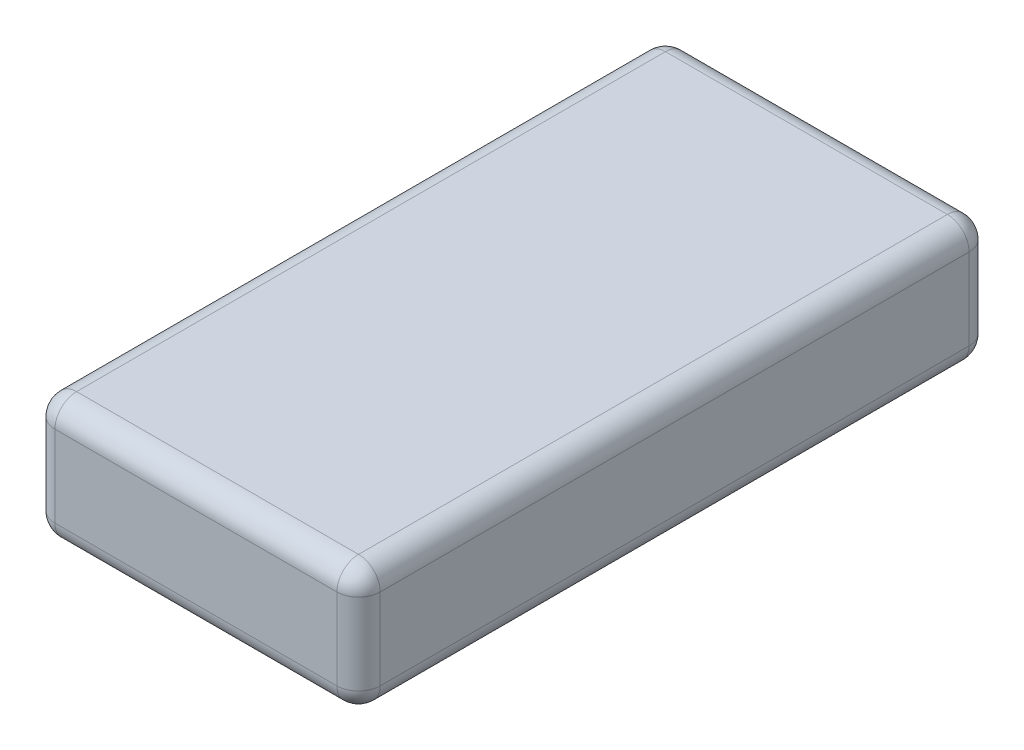
ISO-10303-21;
HEADER;
FILE_DESCRIPTION(('STEP AP214'),'2;1');
FILE_NAME('part.step','',(''),(''),'','','');
FILE_SCHEMA(('AUTOMOTIVE_DESIGN { 1 0 10303 214 1 1 1 1 }'));
ENDSEC;
DATA;
#1=APPLICATION_CONTEXT('core data for automotive mechanical design processes');
#2=APPLICATION_PROTOCOL_DEFINITION('international standard','automotive_design',2000,#1);
#3=PRODUCT_CONTEXT('',#1,'mechanical');
#4=PRODUCT('Part','Part','',(#3));
#5=PRODUCT_RELATED_PRODUCT_CATEGORY('part','',(#4));
#6=PRODUCT_DEFINITION_FORMATION('','',#4);
#7=PRODUCT_DEFINITION_CONTEXT('part definition',#1,'design');
#8=PRODUCT_DEFINITION('design','',#6,#7);
#9=PRODUCT_DEFINITION_SHAPE('','',#8);
#10=(LENGTH_UNIT() NAMED_UNIT(*) SI_UNIT(.MILLI.,.METRE.));
#11=(NAMED_UNIT(*) PLANE_ANGLE_UNIT() SI_UNIT($,.RADIAN.));
#12=(NAMED_UNIT(*) SI_UNIT($,.STERADIAN.) SOLID_ANGLE_UNIT());
#13=UNCERTAINTY_MEASURE_WITH_UNIT(LENGTH_MEASURE(1.E-05),#10,'distance_accuracy_value','');
#14=(GEOMETRIC_REPRESENTATION_CONTEXT(3) GLOBAL_UNCERTAINTY_ASSIGNED_CONTEXT((#13)) GLOBAL_UNIT_ASSIGNED_CONTEXT((#10,
#11,#12)) REPRESENTATION_CONTEXT('',''));
#15=CARTESIAN_POINT('',(0.,0.,0.));
#16=DIRECTION('',(0.,0.,1.));
#17=DIRECTION('',(1.,0.,0.));
#18=AXIS2_PLACEMENT_3D('',#15,#16,#17);
#19=CARTESIAN_POINT('',(15.,11.5,-29.15));
#20=DIRECTION('',(-1.,0.,0.));
#21=DIRECTION('',(0.,0.,1.));
#22=AXIS2_PLACEMENT_3D('',#19,#20,#21);
#23=PLANE('',#22);
#24=DIRECTION('',(0.,-1.,0.));
#25=VECTOR('',#24,1.);
#26=CARTESIAN_POINT('',(15.,11.5,27.15));
#27=LINE('',#26,#25);
#28=CARTESIAN_POINT('',(15.,9.5,27.15));
#29=VERTEX_POINT('',#28);
#30=CARTESIAN_POINT('',(15.,2.,27.15));
#31=VERTEX_POINT('',#30);
#32=EDGE_CURVE('E131',#29,#31,#27,.T.);
#33=ORIENTED_EDGE('',*,*,#32,.T.);
#34=DIRECTION('',(0.,0.,-1.));
#35=VECTOR('',#34,1.);
#36=CARTESIAN_POINT('',(15.,2.,-29.15));
#37=LINE('',#36,#35);
#38=CARTESIAN_POINT('',(15.,2.,-27.15));
#39=VERTEX_POINT('',#38);
#40=EDGE_CURVE('E127',#31,#39,#37,.T.);
#41=ORIENTED_EDGE('',*,*,#40,.T.);
#42=DIRECTION('',(0.,-1.,0.));
#43=VECTOR('',#42,1.);
#44=CARTESIAN_POINT('',(15.,11.5,-27.15));
#45=LINE('',#44,#43);
#46=CARTESIAN_POINT('',(15.,9.5,-27.15));
#47=VERTEX_POINT('',#46);
#48=EDGE_CURVE('E120',#39,#47,#45,.F.);
#49=ORIENTED_EDGE('',*,*,#48,.T.);
#50=DIRECTION('',(0.,0.,-1.));
#51=VECTOR('',#50,1.);
#52=CARTESIAN_POINT('',(15.,9.5,29.15));
#53=LINE('',#52,#51);
#54=EDGE_CURVE('E124',#47,#29,#53,.F.);
#55=ORIENTED_EDGE('',*,*,#54,.T.);
#56=EDGE_LOOP('',(#33,#41,#49,#55));
#57=FACE_BOUND('',#56,.T.);
#58=ADVANCED_FACE('F33',(#57),#23,.F.);
#59=CARTESIAN_POINT('',(-15.,11.5,-29.15));
#60=DIRECTION('',(0.,0.,1.));
#61=DIRECTION('',(1.,0.,0.));
#62=AXIS2_PLACEMENT_3D('',#59,#60,#61);
#63=PLANE('',#62);
#64=DIRECTION('',(-1.,0.,0.));
#65=VECTOR('',#64,1.);
#66=CARTESIAN_POINT('',(15.,9.5,-29.15));
#67=LINE('',#66,#65);
#68=CARTESIAN_POINT('',(-13.,9.5,-29.15));
#69=VERTEX_POINT('',#68);
#70=CARTESIAN_POINT('',(13.,9.5,-29.15));
#71=VERTEX_POINT('',#70);
#72=EDGE_CURVE('E186',#69,#71,#67,.F.);
#73=ORIENTED_EDGE('',*,*,#72,.T.);
#74=DIRECTION('',(0.,-1.,0.));
#75=VECTOR('',#74,1.);
#76=CARTESIAN_POINT('',(13.,11.5,-29.15));
#77=LINE('',#76,#75);
#78=CARTESIAN_POINT('',(13.,2.,-29.15));
#79=VERTEX_POINT('',#78);
#80=EDGE_CURVE('E139',#71,#79,#77,.T.);
#81=ORIENTED_EDGE('',*,*,#80,.T.);
#82=DIRECTION('',(-1.,0.,0.));
#83=VECTOR('',#82,1.);
#84=CARTESIAN_POINT('',(-15.,2.,-29.15));
#85=LINE('',#84,#83);
#86=CARTESIAN_POINT('',(-13.,2.,-29.15));
#87=VERTEX_POINT('',#86);
#88=EDGE_CURVE('E182',#79,#87,#85,.T.);
#89=ORIENTED_EDGE('',*,*,#88,.T.);
#90=DIRECTION('',(0.,-1.,0.));
#91=VECTOR('',#90,1.);
#92=CARTESIAN_POINT('',(-13.,11.5,-29.15));
#93=LINE('',#92,#91);
#94=EDGE_CURVE('E184',#87,#69,#93,.F.);
#95=ORIENTED_EDGE('',*,*,#94,.T.);
#96=EDGE_LOOP('',(#73,#81,#89,#95));
#97=FACE_BOUND('',#96,.T.);
#98=ADVANCED_FACE('F262',(#97),#63,.F.);
#99=CARTESIAN_POINT('',(-15.,11.5,-29.15));
#100=DIRECTION('',(1.,0.,0.));
#101=DIRECTION('',(0.,0.,-1.));
#102=AXIS2_PLACEMENT_3D('',#99,#100,#101);
#103=PLANE('',#102);
#104=DIRECTION('',(0.,-1.,0.));
#105=VECTOR('',#104,1.);
#106=CARTESIAN_POINT('',(-15.,11.5,-27.15));
#107=LINE('',#106,#105);
#108=CARTESIAN_POINT('',(-15.,9.5,-27.15));
#109=VERTEX_POINT('',#108);
#110=CARTESIAN_POINT('',(-15.,2.,-27.15));
#111=VERTEX_POINT('',#110);
#112=EDGE_CURVE('E175',#109,#111,#107,.T.);
#113=ORIENTED_EDGE('',*,*,#112,.T.);
#114=DIRECTION('',(0.,0.,1.));
#115=VECTOR('',#114,1.);
#116=CARTESIAN_POINT('',(-15.,2.,-29.15));
#117=LINE('',#116,#115);
#118=CARTESIAN_POINT('',(-15.,2.,27.15));
#119=VERTEX_POINT('',#118);
#120=EDGE_CURVE('E180',#111,#119,#117,.T.);
#121=ORIENTED_EDGE('',*,*,#120,.T.);
#122=DIRECTION('',(0.,-1.,0.));
#123=VECTOR('',#122,1.);
#124=CARTESIAN_POINT('',(-15.,11.5,27.15));
#125=LINE('',#124,#123);
#126=CARTESIAN_POINT('',(-15.,9.5,27.15));
#127=VERTEX_POINT('',#126);
#128=EDGE_CURVE('E177',#119,#127,#125,.F.);
#129=ORIENTED_EDGE('',*,*,#128,.T.);
#130=DIRECTION('',(0.,0.,1.));
#131=VECTOR('',#130,1.);
#132=CARTESIAN_POINT('',(-15.,9.5,-29.15));
#133=LINE('',#132,#131);
#134=EDGE_CURVE('E173',#127,#109,#133,.F.);
#135=ORIENTED_EDGE('',*,*,#134,.T.);
#136=EDGE_LOOP('',(#113,#121,#129,#135));
#137=FACE_BOUND('',#136,.T.);
#138=ADVANCED_FACE('F309',(#137),#103,.F.);
#139=CARTESIAN_POINT('',(-15.,11.5,29.15));
#140=DIRECTION('',(0.,0.,-1.));
#141=DIRECTION('',(-1.,0.,0.));
#142=AXIS2_PLACEMENT_3D('',#139,#140,#141);
#143=PLANE('',#142);
#144=DIRECTION('',(0.,-1.,0.));
#145=VECTOR('',#144,1.);
#146=CARTESIAN_POINT('',(-13.,11.5,29.15));
#147=LINE('',#146,#145);
#148=CARTESIAN_POINT('',(-13.,9.5,29.15));
#149=VERTEX_POINT('',#148);
#150=CARTESIAN_POINT('',(-13.,2.,29.15));
#151=VERTEX_POINT('',#150);
#152=EDGE_CURVE('E166',#149,#151,#147,.T.);
#153=ORIENTED_EDGE('',*,*,#152,.T.);
#154=DIRECTION('',(1.,0.,0.));
#155=VECTOR('',#154,1.);
#156=CARTESIAN_POINT('',(-15.,2.,29.15));
#157=LINE('',#156,#155);
#158=CARTESIAN_POINT('',(13.,2.,29.15));
#159=VERTEX_POINT('',#158);
#160=EDGE_CURVE('E171',#151,#159,#157,.T.);
#161=ORIENTED_EDGE('',*,*,#160,.T.);
#162=DIRECTION('',(0.,-1.,0.));
#163=VECTOR('',#162,1.);
#164=CARTESIAN_POINT('',(13.,11.5,29.15));
#165=LINE('',#164,#163);
#166=CARTESIAN_POINT('',(13.,9.5,29.15));
#167=VERTEX_POINT('',#166);
#168=EDGE_CURVE('E168',#159,#167,#165,.F.);
#169=ORIENTED_EDGE('',*,*,#168,.T.);
#170=DIRECTION('',(1.,0.,0.));
#171=VECTOR('',#170,1.);
#172=CARTESIAN_POINT('',(-15.,9.5,29.15));
#173=LINE('',#172,#171);
#174=EDGE_CURVE('E164',#167,#149,#173,.F.);
#175=ORIENTED_EDGE('',*,*,#174,.T.);
#176=EDGE_LOOP('',(#153,#161,#169,#175));
#177=FACE_BOUND('',#176,.T.);
#178=ADVANCED_FACE('F476',(#177),#143,.F.);
#179=CARTESIAN_POINT('',(0.,11.5,0.));
#180=DIRECTION('',(0.,1.,0.));
#181=DIRECTION('',(0.,0.,1.));
#182=AXIS2_PLACEMENT_3D('',#179,#180,#181);
#183=PLANE('',#182);
#184=DIRECTION('',(-1.,0.,0.));
#185=VECTOR('',#184,1.);
#186=CARTESIAN_POINT('',(-15.,11.5,-27.15));
#187=LINE('',#186,#185);
#188=CARTESIAN_POINT('',(13.,11.5,-27.15));
#189=VERTEX_POINT('',#188);
#190=CARTESIAN_POINT('',(-13.,11.5,-27.15));
#191=VERTEX_POINT('',#190);
#192=EDGE_CURVE('E193',#189,#191,#187,.T.);
#193=ORIENTED_EDGE('',*,*,#192,.T.);
#194=DIRECTION('',(0.,0.,1.));
#195=VECTOR('',#194,1.);
#196=CARTESIAN_POINT('',(-13.,11.5,29.15));
#197=LINE('',#196,#195);
#198=CARTESIAN_POINT('',(-13.,11.5,27.15));
#199=VERTEX_POINT('',#198);
#200=EDGE_CURVE('E196',#191,#199,#197,.T.);
#201=ORIENTED_EDGE('',*,*,#200,.T.);
#202=DIRECTION('',(1.,0.,0.));
#203=VECTOR('',#202,1.);
#204=CARTESIAN_POINT('',(15.,11.5,27.15));
#205=LINE('',#204,#203);
#206=CARTESIAN_POINT('',(13.,11.5,27.15));
#207=VERTEX_POINT('',#206);
#208=EDGE_CURVE('E191',#199,#207,#205,.T.);
#209=ORIENTED_EDGE('',*,*,#208,.T.);
#210=DIRECTION('',(0.,0.,-1.));
#211=VECTOR('',#210,1.);
#212=CARTESIAN_POINT('',(13.,11.5,-29.15));
#213=LINE('',#212,#211);
#214=EDGE_CURVE('E189',#207,#189,#213,.T.);
#215=ORIENTED_EDGE('',*,*,#214,.T.);
#216=EDGE_LOOP('',(#193,#201,#209,#215));
#217=FACE_BOUND('',#216,.T.);
#218=ADVANCED_FACE('F270',(#217),#183,.T.);
#219=CARTESIAN_POINT('',(0.,0.,0.));
#220=DIRECTION('',(0.,1.,0.));
#221=DIRECTION('',(0.,0.,1.));
#222=AXIS2_PLACEMENT_3D('',#219,#220,#221);
#223=PLANE('',#222);
#224=DIRECTION('',(1.,0.,0.));
#225=VECTOR('',#224,1.);
#226=CARTESIAN_POINT('',(0.,0.,27.15));
#227=LINE('',#226,#225);
#228=CARTESIAN_POINT('',(13.,0.,27.15));
#229=VERTEX_POINT('',#228);
#230=CARTESIAN_POINT('',(-13.,0.,27.15));
#231=VERTEX_POINT('',#230);
#232=EDGE_CURVE('E198',#229,#231,#227,.F.);
#233=ORIENTED_EDGE('',*,*,#232,.T.);
#234=DIRECTION('',(0.,0.,1.));
#235=VECTOR('',#234,1.);
#236=CARTESIAN_POINT('',(-13.,0.,0.));
#237=LINE('',#236,#235);
#238=CARTESIAN_POINT('',(-13.,0.,-27.15));
#239=VERTEX_POINT('',#238);
#240=EDGE_CURVE('E11',#231,#239,#237,.F.);
#241=ORIENTED_EDGE('',*,*,#240,.T.);
#242=DIRECTION('',(-1.,0.,0.));
#243=VECTOR('',#242,1.);
#244=CARTESIAN_POINT('',(0.,0.,-27.15));
#245=LINE('',#244,#243);
#246=CARTESIAN_POINT('',(13.,0.,-27.15));
#247=VERTEX_POINT('',#246);
#248=EDGE_CURVE('E42',#239,#247,#245,.F.);
#249=ORIENTED_EDGE('',*,*,#248,.T.);
#250=DIRECTION('',(0.,0.,-1.));
#251=VECTOR('',#250,1.);
#252=CARTESIAN_POINT('',(13.,0.,0.));
#253=LINE('',#252,#251);
#254=EDGE_CURVE('E200',#247,#229,#253,.F.);
#255=ORIENTED_EDGE('',*,*,#254,.T.);
#256=EDGE_LOOP('',(#233,#241,#249,#255));
#257=FACE_BOUND('',#256,.T.);
#258=ADVANCED_FACE('F462',(#257),#223,.F.);
#259=CARTESIAN_POINT('',(-13.,11.5,-27.15));
#260=DIRECTION('',(0.,-1.,0.));
#261=DIRECTION('',(0.,0.,-1.));
#262=AXIS2_PLACEMENT_3D('',#259,#260,#261);
#263=CYLINDRICAL_SURFACE('',#262,2.);
#264=CARTESIAN_POINT('',(-13.,9.5,-27.15));
#265=DIRECTION('',(0.,1.,0.));
#266=DIRECTION('',(0.,0.,1.));
#267=AXIS2_PLACEMENT_3D('',#264,#265,#266);
#268=CIRCLE('',#267,2.);
#269=EDGE_CURVE('E37',#69,#109,#268,.T.);
#270=ORIENTED_EDGE('',*,*,#269,.F.);
#271=ORIENTED_EDGE('',*,*,#94,.F.);
#272=CARTESIAN_POINT('',(-13.,2.,-27.15));
#273=DIRECTION('',(0.,-1.,0.));
#274=DIRECTION('',(0.,0.,-1.));
#275=AXIS2_PLACEMENT_3D('',#272,#273,#274);
#276=CIRCLE('',#275,2.);
#277=EDGE_CURVE('E160',#111,#87,#276,.T.);
#278=ORIENTED_EDGE('',*,*,#277,.F.);
#279=ORIENTED_EDGE('',*,*,#112,.F.);
#280=EDGE_LOOP('',(#270,#271,#278,#279));
#281=FACE_BOUND('',#280,.T.);
#282=ADVANCED_FACE('F35',(#281),#263,.T.);
#283=CARTESIAN_POINT('',(-13.,9.5,-27.15));
#284=DIRECTION('',(0.,0.,1.));
#285=DIRECTION('',(1.,0.,0.));
#286=AXIS2_PLACEMENT_3D('',#283,#284,#285);
#287=SPHERICAL_SURFACE('',#286,2.);
#288=CARTESIAN_POINT('',(-13.,9.5,-27.15));
#289=DIRECTION('',(-1.,0.,0.));
#290=DIRECTION('',(0.,0.,1.));
#291=AXIS2_PLACEMENT_3D('',#288,#289,#290);
#292=CIRCLE('',#291,2.);
#293=EDGE_CURVE('E244',#69,#191,#292,.F.);
#294=ORIENTED_EDGE('',*,*,#293,.F.);
#295=ORIENTED_EDGE('',*,*,#269,.T.);
#296=CARTESIAN_POINT('',(-13.,9.5,-27.15));
#297=DIRECTION('',(0.,0.,-1.));
#298=DIRECTION('',(-1.,0.,0.));
#299=AXIS2_PLACEMENT_3D('',#296,#297,#298);
#300=CIRCLE('',#299,2.);
#301=EDGE_CURVE('E247',#191,#109,#300,.F.);
#302=ORIENTED_EDGE('',*,*,#301,.F.);
#303=EDGE_LOOP('',(#294,#295,#302));
#304=FACE_BOUND('',#303,.T.);
#305=ADVANCED_FACE('F447',(#304),#287,.T.);
#306=CARTESIAN_POINT('',(-13.,2.,-27.15));
#307=DIRECTION('',(0.,0.,1.));
#308=DIRECTION('',(1.,0.,0.));
#309=AXIS2_PLACEMENT_3D('',#306,#307,#308);
#310=SPHERICAL_SURFACE('',#309,2.);
#311=CARTESIAN_POINT('',(-13.,2.,-27.15));
#312=DIRECTION('',(0.,0.,-1.));
#313=DIRECTION('',(-1.,0.,0.));
#314=AXIS2_PLACEMENT_3D('',#311,#312,#313);
#315=CIRCLE('',#314,2.);
#316=EDGE_CURVE('E239',#111,#239,#315,.F.);
#317=ORIENTED_EDGE('',*,*,#316,.F.);
#318=ORIENTED_EDGE('',*,*,#277,.T.);
#319=CARTESIAN_POINT('',(-13.,2.,-27.15));
#320=DIRECTION('',(-1.,0.,0.));
#321=DIRECTION('',(0.,0.,1.));
#322=AXIS2_PLACEMENT_3D('',#319,#320,#321);
#323=CIRCLE('',#322,2.);
#324=EDGE_CURVE('E242',#239,#87,#323,.F.);
#325=ORIENTED_EDGE('',*,*,#324,.F.);
#326=EDGE_LOOP('',(#317,#318,#325));
#327=FACE_BOUND('',#326,.T.);
#328=ADVANCED_FACE('F253',(#327),#310,.T.);
#329=CARTESIAN_POINT('',(-13.,9.5,0.));
#330=DIRECTION('',(0.,0.,-1.));
#331=DIRECTION('',(-1.,0.,0.));
#332=AXIS2_PLACEMENT_3D('',#329,#330,#331);
#333=CYLINDRICAL_SURFACE('',#332,2.);
#334=ORIENTED_EDGE('',*,*,#301,.T.);
#335=ORIENTED_EDGE('',*,*,#134,.F.);
#336=CARTESIAN_POINT('',(-13.,9.5,27.15));
#337=DIRECTION('',(0.,0.,1.));
#338=DIRECTION('',(1.,0.,0.));
#339=AXIS2_PLACEMENT_3D('',#336,#337,#338);
#340=CIRCLE('',#339,2.);
#341=EDGE_CURVE('E234',#199,#127,#340,.T.);
#342=ORIENTED_EDGE('',*,*,#341,.F.);
#343=ORIENTED_EDGE('',*,*,#200,.F.);
#344=EDGE_LOOP('',(#334,#335,#342,#343));
#345=FACE_BOUND('',#344,.T.);
#346=ADVANCED_FACE('F431',(#345),#333,.T.);
#347=CARTESIAN_POINT('',(0.,9.5,-27.15));
#348=DIRECTION('',(1.,0.,0.));
#349=DIRECTION('',(0.,0.,-1.));
#350=AXIS2_PLACEMENT_3D('',#347,#348,#349);
#351=CYLINDRICAL_SURFACE('',#350,2.);
#352=ORIENTED_EDGE('',*,*,#293,.T.);
#353=ORIENTED_EDGE('',*,*,#192,.F.);
#354=CARTESIAN_POINT('',(13.,9.5,-27.15));
#355=DIRECTION('',(1.,0.,0.));
#356=DIRECTION('',(0.,1.,0.));
#357=AXIS2_PLACEMENT_3D('',#354,#355,#356);
#358=CIRCLE('',#357,2.);
#359=EDGE_CURVE('E143',#71,#189,#358,.T.);
#360=ORIENTED_EDGE('',*,*,#359,.F.);
#361=ORIENTED_EDGE('',*,*,#72,.F.);
#362=EDGE_LOOP('',(#352,#353,#360,#361));
#363=FACE_BOUND('',#362,.T.);
#364=ADVANCED_FACE('F266',(#363),#351,.T.);
#365=CARTESIAN_POINT('',(13.,11.5,-27.15));
#366=DIRECTION('',(0.,-1.,0.));
#367=DIRECTION('',(0.,0.,-1.));
#368=AXIS2_PLACEMENT_3D('',#365,#366,#367);
#369=CYLINDRICAL_SURFACE('',#368,2.);
#370=CARTESIAN_POINT('',(13.,2.,-27.15));
#371=DIRECTION('',(0.,-1.,0.));
#372=DIRECTION('',(0.,0.,-1.));
#373=AXIS2_PLACEMENT_3D('',#370,#371,#372);
#374=CIRCLE('',#373,2.);
#375=EDGE_CURVE('E144',#79,#39,#374,.T.);
#376=ORIENTED_EDGE('',*,*,#375,.F.);
#377=ORIENTED_EDGE('',*,*,#80,.F.);
#378=CARTESIAN_POINT('',(13.,9.5,-27.15));
#379=DIRECTION('',(0.,1.,0.));
#380=DIRECTION('',(0.,0.,1.));
#381=AXIS2_PLACEMENT_3D('',#378,#379,#380);
#382=CIRCLE('',#381,2.);
#383=EDGE_CURVE('E135',#47,#71,#382,.T.);
#384=ORIENTED_EDGE('',*,*,#383,.F.);
#385=ORIENTED_EDGE('',*,*,#48,.F.);
#386=EDGE_LOOP('',(#376,#377,#384,#385));
#387=FACE_BOUND('',#386,.T.);
#388=ADVANCED_FACE('F137',(#387),#369,.T.);
#389=CARTESIAN_POINT('',(-15.,2.,-27.15));
#390=DIRECTION('',(-1.,0.,0.));
#391=DIRECTION('',(0.,0.,1.));
#392=AXIS2_PLACEMENT_3D('',#389,#390,#391);
#393=CYLINDRICAL_SURFACE('',#392,2.);
#394=ORIENTED_EDGE('',*,*,#324,.T.);
#395=ORIENTED_EDGE('',*,*,#88,.F.);
#396=CARTESIAN_POINT('',(13.,2.,-27.15));
#397=DIRECTION('',(1.,0.,0.));
#398=DIRECTION('',(0.,0.,-1.));
#399=AXIS2_PLACEMENT_3D('',#396,#397,#398);
#400=CIRCLE('',#399,2.);
#401=EDGE_CURVE('E230',#247,#79,#400,.T.);
#402=ORIENTED_EDGE('',*,*,#401,.F.);
#403=ORIENTED_EDGE('',*,*,#248,.F.);
#404=EDGE_LOOP('',(#394,#395,#402,#403));
#405=FACE_BOUND('',#404,.T.);
#406=ADVANCED_FACE('F259',(#405),#393,.T.);
#407=CARTESIAN_POINT('',(-13.,2.,-29.15));
#408=DIRECTION('',(0.,0.,1.));
#409=DIRECTION('',(1.,0.,0.));
#410=AXIS2_PLACEMENT_3D('',#407,#408,#409);
#411=CYLINDRICAL_SURFACE('',#410,2.);
#412=ORIENTED_EDGE('',*,*,#316,.T.);
#413=ORIENTED_EDGE('',*,*,#240,.F.);
#414=CARTESIAN_POINT('',(-13.,2.,27.15));
#415=DIRECTION('',(0.,0.,1.));
#416=DIRECTION('',(1.,0.,0.));
#417=AXIS2_PLACEMENT_3D('',#414,#415,#416);
#418=CIRCLE('',#417,2.);
#419=EDGE_CURVE('E227',#119,#231,#418,.T.);
#420=ORIENTED_EDGE('',*,*,#419,.F.);
#421=ORIENTED_EDGE('',*,*,#120,.F.);
#422=EDGE_LOOP('',(#412,#413,#420,#421));
#423=FACE_BOUND('',#422,.T.);
#424=ADVANCED_FACE('F400',(#423),#411,.T.);
#425=CARTESIAN_POINT('',(-13.,11.5,27.15));
#426=DIRECTION('',(0.,-1.,0.));
#427=DIRECTION('',(0.,0.,-1.));
#428=AXIS2_PLACEMENT_3D('',#425,#426,#427);
#429=CYLINDRICAL_SURFACE('',#428,2.);
#430=CARTESIAN_POINT('',(-13.,9.5,27.15));
#431=DIRECTION('',(0.,1.,0.));
#432=DIRECTION('',(0.,0.,1.));
#433=AXIS2_PLACEMENT_3D('',#430,#431,#432);
#434=CIRCLE('',#433,2.);
#435=EDGE_CURVE('E236',#127,#149,#434,.T.);
#436=ORIENTED_EDGE('',*,*,#435,.F.);
#437=ORIENTED_EDGE('',*,*,#128,.F.);
#438=CARTESIAN_POINT('',(-13.,2.,27.15));
#439=DIRECTION('',(0.,-1.,0.));
#440=DIRECTION('',(0.,0.,-1.));
#441=AXIS2_PLACEMENT_3D('',#438,#439,#440);
#442=CIRCLE('',#441,2.);
#443=EDGE_CURVE('E224',#151,#119,#442,.T.);
#444=ORIENTED_EDGE('',*,*,#443,.F.);
#445=ORIENTED_EDGE('',*,*,#152,.F.);
#446=EDGE_LOOP('',(#436,#437,#444,#445));
#447=FACE_BOUND('',#446,.T.);
#448=ADVANCED_FACE('F391',(#447),#429,.T.);
#449=CARTESIAN_POINT('',(-13.,9.5,27.15));
#450=DIRECTION('',(0.,0.,1.));
#451=DIRECTION('',(1.,0.,0.));
#452=AXIS2_PLACEMENT_3D('',#449,#450,#451);
#453=SPHERICAL_SURFACE('',#452,2.);
#454=ORIENTED_EDGE('',*,*,#341,.T.);
#455=ORIENTED_EDGE('',*,*,#435,.T.);
#456=CARTESIAN_POINT('',(-13.,9.5,27.15));
#457=DIRECTION('',(-1.,0.,0.));
#458=DIRECTION('',(0.,0.,1.));
#459=AXIS2_PLACEMENT_3D('',#456,#457,#458);
#460=CIRCLE('',#459,2.);
#461=EDGE_CURVE('E151',#199,#149,#460,.F.);
#462=ORIENTED_EDGE('',*,*,#461,.F.);
#463=EDGE_LOOP('',(#454,#455,#462));
#464=FACE_BOUND('',#463,.T.);
#465=ADVANCED_FACE('F302',(#464),#453,.T.);
#466=CARTESIAN_POINT('',(13.,9.5,-27.15));
#467=DIRECTION('',(0.,0.,1.));
#468=DIRECTION('',(1.,0.,0.));
#469=AXIS2_PLACEMENT_3D('',#466,#467,#468);
#470=SPHERICAL_SURFACE('',#469,2.);
#471=ORIENTED_EDGE('',*,*,#383,.T.);
#472=ORIENTED_EDGE('',*,*,#359,.T.);
#473=CARTESIAN_POINT('',(13.,9.5,-27.15));
#474=DIRECTION('',(0.,0.,-1.));
#475=DIRECTION('',(-1.,0.,0.));
#476=AXIS2_PLACEMENT_3D('',#473,#474,#475);
#477=CIRCLE('',#476,2.);
#478=EDGE_CURVE('E147',#47,#189,#477,.F.);
#479=ORIENTED_EDGE('',*,*,#478,.F.);
#480=EDGE_LOOP('',(#471,#472,#479));
#481=FACE_BOUND('',#480,.T.);
#482=ADVANCED_FACE('F148',(#481),#470,.T.);
#483=CARTESIAN_POINT('',(13.,2.,-27.15));
#484=DIRECTION('',(0.,0.,1.));
#485=DIRECTION('',(1.,0.,0.));
#486=AXIS2_PLACEMENT_3D('',#483,#484,#485);
#487=SPHERICAL_SURFACE('',#486,2.);
#488=ORIENTED_EDGE('',*,*,#401,.T.);
#489=ORIENTED_EDGE('',*,*,#375,.T.);
#490=CARTESIAN_POINT('',(13.,2.,-27.15));
#491=DIRECTION('',(0.,0.,-1.));
#492=DIRECTION('',(-1.,0.,0.));
#493=AXIS2_PLACEMENT_3D('',#490,#491,#492);
#494=CIRCLE('',#493,2.);
#495=EDGE_CURVE('E152',#247,#39,#494,.F.);
#496=ORIENTED_EDGE('',*,*,#495,.F.);
#497=EDGE_LOOP('',(#488,#489,#496));
#498=FACE_BOUND('',#497,.T.);
#499=ADVANCED_FACE('F292',(#498),#487,.T.);
#500=CARTESIAN_POINT('',(-13.,2.,27.15));
#501=DIRECTION('',(0.,0.,1.));
#502=DIRECTION('',(1.,0.,0.));
#503=AXIS2_PLACEMENT_3D('',#500,#501,#502);
#504=SPHERICAL_SURFACE('',#503,2.);
#505=ORIENTED_EDGE('',*,*,#443,.T.);
#506=ORIENTED_EDGE('',*,*,#419,.T.);
#507=CARTESIAN_POINT('',(-13.,2.,27.15));
#508=DIRECTION('',(-1.,0.,0.));
#509=DIRECTION('',(0.,0.,1.));
#510=AXIS2_PLACEMENT_3D('',#507,#508,#509);
#511=CIRCLE('',#510,2.);
#512=EDGE_CURVE('E217',#151,#231,#511,.F.);
#513=ORIENTED_EDGE('',*,*,#512,.F.);
#514=EDGE_LOOP('',(#505,#506,#513));
#515=FACE_BOUND('',#514,.T.);
#516=ADVANCED_FACE('F294',(#515),#504,.T.);
#517=CARTESIAN_POINT('',(0.,9.5,27.15));
#518=DIRECTION('',(-1.,0.,0.));
#519=DIRECTION('',(0.,0.,1.));
#520=AXIS2_PLACEMENT_3D('',#517,#518,#519);
#521=CYLINDRICAL_SURFACE('',#520,2.);
#522=ORIENTED_EDGE('',*,*,#461,.T.);
#523=ORIENTED_EDGE('',*,*,#174,.F.);
#524=CARTESIAN_POINT('',(13.,9.5,27.15));
#525=DIRECTION('',(1.,0.,0.));
#526=DIRECTION('',(0.,0.,-1.));
#527=AXIS2_PLACEMENT_3D('',#524,#525,#526);
#528=CIRCLE('',#527,2.);
#529=EDGE_CURVE('E214',#207,#167,#528,.T.);
#530=ORIENTED_EDGE('',*,*,#529,.F.);
#531=ORIENTED_EDGE('',*,*,#208,.F.);
#532=EDGE_LOOP('',(#522,#523,#530,#531));
#533=FACE_BOUND('',#532,.T.);
#534=ADVANCED_FACE('F276',(#533),#521,.T.);
#535=CARTESIAN_POINT('',(13.,9.5,0.));
#536=DIRECTION('',(0.,0.,1.));
#537=DIRECTION('',(1.,0.,0.));
#538=AXIS2_PLACEMENT_3D('',#535,#536,#537);
#539=CYLINDRICAL_SURFACE('',#538,2.);
#540=ORIENTED_EDGE('',*,*,#478,.T.);
#541=ORIENTED_EDGE('',*,*,#214,.F.);
#542=CARTESIAN_POINT('',(13.,9.5,27.15));
#543=DIRECTION('',(0.,0.,1.));
#544=DIRECTION('',(1.,0.,0.));
#545=AXIS2_PLACEMENT_3D('',#542,#543,#544);
#546=CIRCLE('',#545,2.);
#547=EDGE_CURVE('E156',#29,#207,#546,.T.);
#548=ORIENTED_EDGE('',*,*,#547,.F.);
#549=ORIENTED_EDGE('',*,*,#54,.F.);
#550=EDGE_LOOP('',(#540,#541,#548,#549));
#551=FACE_BOUND('',#550,.T.);
#552=ADVANCED_FACE('F154',(#551),#539,.T.);
#553=CARTESIAN_POINT('',(13.,2.,-29.15));
#554=DIRECTION('',(0.,0.,-1.));
#555=DIRECTION('',(-1.,0.,0.));
#556=AXIS2_PLACEMENT_3D('',#553,#554,#555);
#557=CYLINDRICAL_SURFACE('',#556,2.);
#558=ORIENTED_EDGE('',*,*,#495,.T.);
#559=ORIENTED_EDGE('',*,*,#40,.F.);
#560=CARTESIAN_POINT('',(13.,2.,27.15));
#561=DIRECTION('',(0.,0.,1.));
#562=DIRECTION('',(1.,0.,0.));
#563=AXIS2_PLACEMENT_3D('',#560,#561,#562);
#564=CIRCLE('',#563,2.);
#565=EDGE_CURVE('E210',#229,#31,#564,.T.);
#566=ORIENTED_EDGE('',*,*,#565,.F.);
#567=ORIENTED_EDGE('',*,*,#254,.F.);
#568=EDGE_LOOP('',(#558,#559,#566,#567));
#569=FACE_BOUND('',#568,.T.);
#570=ADVANCED_FACE('F290',(#569),#557,.T.);
#571=CARTESIAN_POINT('',(-15.,2.,27.15));
#572=DIRECTION('',(1.,0.,0.));
#573=DIRECTION('',(0.,0.,-1.));
#574=AXIS2_PLACEMENT_3D('',#571,#572,#573);
#575=CYLINDRICAL_SURFACE('',#574,2.);
#576=ORIENTED_EDGE('',*,*,#512,.T.);
#577=ORIENTED_EDGE('',*,*,#232,.F.);
#578=CARTESIAN_POINT('',(13.,2.,27.15));
#579=DIRECTION('',(1.,0.,0.));
#580=DIRECTION('',(0.,0.,-1.));
#581=AXIS2_PLACEMENT_3D('',#578,#579,#580);
#582=CIRCLE('',#581,2.);
#583=EDGE_CURVE('E207',#159,#229,#582,.T.);
#584=ORIENTED_EDGE('',*,*,#583,.F.);
#585=ORIENTED_EDGE('',*,*,#160,.F.);
#586=EDGE_LOOP('',(#576,#577,#584,#585));
#587=FACE_BOUND('',#586,.T.);
#588=ADVANCED_FACE('F319',(#587),#575,.T.);
#589=CARTESIAN_POINT('',(13.,9.5,27.15));
#590=DIRECTION('',(0.,0.,1.));
#591=DIRECTION('',(1.,0.,0.));
#592=AXIS2_PLACEMENT_3D('',#589,#590,#591);
#593=SPHERICAL_SURFACE('',#592,2.);
#594=ORIENTED_EDGE('',*,*,#547,.T.);
#595=ORIENTED_EDGE('',*,*,#529,.T.);
#596=CARTESIAN_POINT('',(13.,9.5,27.15));
#597=DIRECTION('',(0.,1.,0.));
#598=DIRECTION('',(0.,0.,1.));
#599=AXIS2_PLACEMENT_3D('',#596,#597,#598);
#600=CIRCLE('',#599,2.);
#601=EDGE_CURVE('E205',#29,#167,#600,.F.);
#602=ORIENTED_EDGE('',*,*,#601,.F.);
#603=EDGE_LOOP('',(#594,#595,#602));
#604=FACE_BOUND('',#603,.T.);
#605=ADVANCED_FACE('F278',(#604),#593,.T.);
#606=CARTESIAN_POINT('',(13.,2.,27.15));
#607=DIRECTION('',(0.,0.,1.));
#608=DIRECTION('',(1.,0.,0.));
#609=AXIS2_PLACEMENT_3D('',#606,#607,#608);
#610=SPHERICAL_SURFACE('',#609,2.);
#611=ORIENTED_EDGE('',*,*,#583,.T.);
#612=ORIENTED_EDGE('',*,*,#565,.T.);
#613=CARTESIAN_POINT('',(13.,2.,27.15));
#614=DIRECTION('',(0.,-1.,0.));
#615=DIRECTION('',(0.,0.,-1.));
#616=AXIS2_PLACEMENT_3D('',#613,#614,#615);
#617=CIRCLE('',#616,2.);
#618=EDGE_CURVE('E203',#159,#31,#617,.F.);
#619=ORIENTED_EDGE('',*,*,#618,.F.);
#620=EDGE_LOOP('',(#611,#612,#619));
#621=FACE_BOUND('',#620,.T.);
#622=ADVANCED_FACE('F286',(#621),#610,.T.);
#623=CARTESIAN_POINT('',(13.,11.5,27.15));
#624=DIRECTION('',(0.,-1.,0.));
#625=DIRECTION('',(0.,0.,-1.));
#626=AXIS2_PLACEMENT_3D('',#623,#624,#625);
#627=CYLINDRICAL_SURFACE('',#626,2.);
#628=ORIENTED_EDGE('',*,*,#601,.T.);
#629=ORIENTED_EDGE('',*,*,#168,.F.);
#630=ORIENTED_EDGE('',*,*,#618,.T.);
#631=ORIENTED_EDGE('',*,*,#32,.F.);
#632=EDGE_LOOP('',(#628,#629,#630,#631));
#633=FACE_BOUND('',#632,.T.);
#634=ADVANCED_FACE('F282',(#633),#627,.T.);
#635=CLOSED_SHELL('',(#58,#98,#138,#178,#218,#258,#282,#305,#328,#346,#364,#388,#406,#424,#448,
#465,#482,#499,#516,#534,#552,#570,#588,#605,#622,#634));
#636=MANIFOLD_SOLID_BREP('B2',#635);
#637=ADVANCED_BREP_SHAPE_REPRESENTATION('',(#18,#636),#14);
#638=SHAPE_DEFINITION_REPRESENTATION(#9,#637);
ENDSEC;
END-ISO-10303-21;
